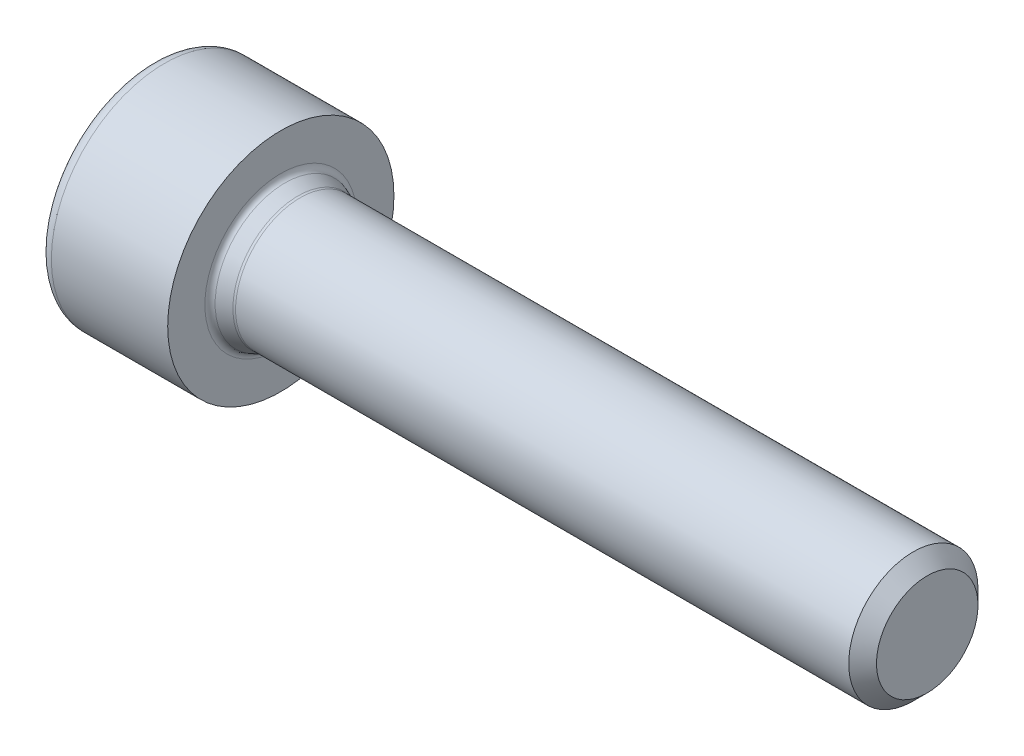
ISO-10303-21;
HEADER;
FILE_DESCRIPTION(('STEP AP214'),'2;1');
FILE_NAME('part.step','',(''),(''),'','','');
FILE_SCHEMA(('AUTOMOTIVE_DESIGN { 1 0 10303 214 1 1 1 1 }'));
ENDSEC;
DATA;
#1=APPLICATION_CONTEXT('core data for automotive mechanical design processes');
#2=APPLICATION_PROTOCOL_DEFINITION('international standard','automotive_design',2000,#1);
#3=PRODUCT_CONTEXT('',#1,'mechanical');
#4=PRODUCT('Part','Part','',(#3));
#5=PRODUCT_RELATED_PRODUCT_CATEGORY('part','',(#4));
#6=PRODUCT_DEFINITION_FORMATION('','',#4);
#7=PRODUCT_DEFINITION_CONTEXT('part definition',#1,'design');
#8=PRODUCT_DEFINITION('design','',#6,#7);
#9=PRODUCT_DEFINITION_SHAPE('','',#8);
#10=(LENGTH_UNIT() NAMED_UNIT(*) SI_UNIT(.MILLI.,.METRE.));
#11=(NAMED_UNIT(*) PLANE_ANGLE_UNIT() SI_UNIT($,.RADIAN.));
#12=(NAMED_UNIT(*) SI_UNIT($,.STERADIAN.) SOLID_ANGLE_UNIT());
#13=UNCERTAINTY_MEASURE_WITH_UNIT(LENGTH_MEASURE(1.E-05),#10,'distance_accuracy_value','');
#14=(GEOMETRIC_REPRESENTATION_CONTEXT(3) GLOBAL_UNCERTAINTY_ASSIGNED_CONTEXT((#13)) GLOBAL_UNIT_ASSIGNED_CONTEXT((#10,
#11,#12)) REPRESENTATION_CONTEXT('',''));
#15=CARTESIAN_POINT('',(0.,0.,0.));
#16=DIRECTION('',(0.,0.,1.));
#17=DIRECTION('',(1.,0.,0.));
#18=AXIS2_PLACEMENT_3D('',#15,#16,#17);
#19=CARTESIAN_POINT('',(-2.,0.,0.));
#20=DIRECTION('',(-1.,0.,0.));
#21=DIRECTION('',(0.,0.,1.));
#22=AXIS2_PLACEMENT_3D('',#19,#20,#21);
#23=CONICAL_SURFACE('',#22,1.5,1.0471975511966);
#24=CARTESIAN_POINT('',(-2.,0.,0.));
#25=DIRECTION('',(1.,0.,0.));
#26=DIRECTION('',(0.,0.,-1.));
#27=AXIS2_PLACEMENT_3D('',#24,#25,#26);
#28=CIRCLE('',#27,1.5);
#29=CARTESIAN_POINT('',(-2.,0.,-1.5));
#30=VERTEX_POINT('',#29);
#31=CARTESIAN_POINT('',(-2.,1.29903810567666,-0.75));
#32=VERTEX_POINT('',#31);
#33=EDGE_CURVE('E362',#30,#32,#28,.T.);
#34=ORIENTED_EDGE('',*,*,#33,.F.);
#35=CARTESIAN_POINT('',(-2.,0.,0.));
#36=DIRECTION('',(1.,0.,0.));
#37=DIRECTION('',(0.,0.,1.));
#38=AXIS2_PLACEMENT_3D('',#35,#36,#37);
#39=CIRCLE('',#38,1.5);
#40=CARTESIAN_POINT('',(-2.,-1.29903810567666,-0.75));
#41=VERTEX_POINT('',#40);
#42=EDGE_CURVE('E376',#41,#30,#39,.T.);
#43=ORIENTED_EDGE('',*,*,#42,.F.);
#44=CARTESIAN_POINT('',(-2.,0.,0.));
#45=DIRECTION('',(1.,0.,0.));
#46=DIRECTION('',(0.,0.,1.));
#47=AXIS2_PLACEMENT_3D('',#44,#45,#46);
#48=CIRCLE('',#47,1.5);
#49=CARTESIAN_POINT('',(-2.,-1.29903810567666,0.75));
#50=VERTEX_POINT('',#49);
#51=EDGE_CURVE('E387',#50,#41,#48,.T.);
#52=ORIENTED_EDGE('',*,*,#51,.F.);
#53=CARTESIAN_POINT('',(-2.,0.,0.));
#54=DIRECTION('',(1.,0.,0.));
#55=DIRECTION('',(0.,0.,1.));
#56=AXIS2_PLACEMENT_3D('',#53,#54,#55);
#57=CIRCLE('',#56,1.5);
#58=CARTESIAN_POINT('',(-2.,0.,1.5));
#59=VERTEX_POINT('',#58);
#60=EDGE_CURVE('E660',#59,#50,#57,.T.);
#61=ORIENTED_EDGE('',*,*,#60,.F.);
#62=CARTESIAN_POINT('',(-2.,0.,0.));
#63=DIRECTION('',(1.,0.,0.));
#64=DIRECTION('',(0.,0.,1.));
#65=AXIS2_PLACEMENT_3D('',#62,#63,#64);
#66=CIRCLE('',#65,1.5);
#67=CARTESIAN_POINT('',(-2.,1.29903810567666,0.75));
#68=VERTEX_POINT('',#67);
#69=EDGE_CURVE('E11',#68,#59,#66,.T.);
#70=ORIENTED_EDGE('',*,*,#69,.F.);
#71=CARTESIAN_POINT('',(-2.,0.,0.));
#72=DIRECTION('',(1.,0.,0.));
#73=DIRECTION('',(0.,0.,1.));
#74=AXIS2_PLACEMENT_3D('',#71,#72,#73);
#75=CIRCLE('',#74,1.5);
#76=EDGE_CURVE('E382',#32,#68,#75,.T.);
#77=ORIENTED_EDGE('',*,*,#76,.F.);
#78=EDGE_LOOP('',(#34,#43,#52,#61,#70,#77));
#79=FACE_BOUND('',#78,.T.);
#80=CARTESIAN_POINT('',(-1.13397459621556,0.,0.));
#81=VERTEX_POINT('',#80);
#82=VERTEX_LOOP('',#81);
#83=FACE_BOUND('',#82,.T.);
#84=ADVANCED_FACE('F16',(#79,#83),#23,.F.);
#85=CARTESIAN_POINT('',(-2.,1.5,0.));
#86=DIRECTION('',(-1.,0.,0.));
#87=DIRECTION('',(0.,0.,1.));
#88=AXIS2_PLACEMENT_3D('',#85,#86,#87);
#89=PLANE('',#88);
#90=DIRECTION('',(0.,-0.5,0.866025403784439));
#91=VECTOR('',#90,1.);
#92=CARTESIAN_POINT('',(-2.,1.73205080756888,0.));
#93=LINE('',#92,#91);
#94=CARTESIAN_POINT('',(-2.,0.866025403784439,1.5));
#95=VERTEX_POINT('',#94);
#96=EDGE_CURVE('E28',#68,#95,#93,.T.);
#97=ORIENTED_EDGE('',*,*,#96,.F.);
#98=ORIENTED_EDGE('',*,*,#69,.T.);
#99=DIRECTION('',(0.,-1.,0.));
#100=VECTOR('',#99,1.);
#101=CARTESIAN_POINT('',(-2.,0.866025403784439,1.5));
#102=LINE('',#101,#100);
#103=EDGE_CURVE('E158',#95,#59,#102,.T.);
#104=ORIENTED_EDGE('',*,*,#103,.F.);
#105=EDGE_LOOP('',(#97,#98,#104));
#106=FACE_BOUND('',#105,.T.);
#107=ADVANCED_FACE('F263',(#106),#89,.T.);
#108=CARTESIAN_POINT('',(-2.,1.73205080756888,0.));
#109=DIRECTION('',(0.,-0.866025403784439,-0.5));
#110=DIRECTION('',(0.,0.5,-0.866025403784439));
#111=AXIS2_PLACEMENT_3D('',#108,#109,#110);
#112=PLANE('',#111);
#113=CARTESIAN_POINT('',(-3.99541053160954,1.73205080756799,-2.91415085731727E-13));
#114=CARTESIAN_POINT('',(-3.98491609936371,1.71387248660795,0.0314813500999125));
#115=CARTESIAN_POINT('',(-3.97487813695248,1.69562947387949,0.0630817864731254));
#116=CARTESIAN_POINT('',(-3.95606958148687,1.65945843540032,0.125756771127396));
#117=CARTESIAN_POINT('',(-3.94727428627704,1.64153340605649,0.156825653831237));
#118=CARTESIAN_POINT('',(-3.93094719604928,1.60591237011731,0.218590620594916));
#119=CARTESIAN_POINT('',(-3.92339436067336,1.58821858581754,0.249282388351878));
#120=CARTESIAN_POINT('',(-3.90955276383433,1.55295548320414,0.310459474175655));
#121=CARTESIAN_POINT('',(-3.90324856990244,1.53538762515303,0.340942133964703));
#122=CARTESIAN_POINT('',(-3.89162174472688,1.49940622764457,0.403241413656977));
#123=CARTESIAN_POINT('',(-3.88634723670264,1.48098651807855,0.435063513460752));
#124=CARTESIAN_POINT('',(-3.87732547646582,1.4444129547335,0.498235664126605));
#125=CARTESIAN_POINT('',(-3.87355036672699,1.42626094890301,0.529582771932558));
#126=CARTESIAN_POINT('',(-3.86752016574308,1.39009868748624,0.592129366346406));
#127=CARTESIAN_POINT('',(-3.86525178705197,1.37208861545174,0.623327667256955));
#128=CARTESIAN_POINT('',(-3.86221737174893,1.33601425471143,0.68587769379456));
#129=CARTESIAN_POINT('',(-3.86145538772594,1.31794995034123,0.717229606428529));
#130=CARTESIAN_POINT('',(-3.86141748043473,1.28172760162123,0.779996829665478));
#131=CARTESIAN_POINT('',(-3.86214570928683,1.26356943635161,0.811412073096422));
#132=CARTESIAN_POINT('',(-3.86512214301144,1.22735081354673,0.874131954530842));
#133=CARTESIAN_POINT('',(-3.86736689792117,1.20929022782371,0.905436681815724));
#134=CARTESIAN_POINT('',(-3.87335893837123,1.17309638852142,0.968258671361456));
#135=CARTESIAN_POINT('',(-3.87712031909711,1.15496407896759,0.999775121230081));
#136=CARTESIAN_POINT('',(-3.88612267814765,1.11839911263106,1.0632951346093));
#137=CARTESIAN_POINT('',(-3.89139242195919,1.09996792366837,1.09529543037641));
#138=CARTESIAN_POINT('',(-3.90301947272482,1.06383160289439,1.15787856269248));
#139=CARTESIAN_POINT('',(-3.90932868001401,1.04612512102595,1.18846961607005));
#140=CARTESIAN_POINT('',(-3.92319039056356,1.01059964207876,1.24985728968498));
#141=CARTESIAN_POINT('',(-3.93075805708399,0.992782196260882,1.28065137584001));
#142=CARTESIAN_POINT('',(-3.94712379360495,0.956940594771838,1.34262457162865));
#143=CARTESIAN_POINT('',(-3.95594278256656,0.938919081836445,1.37379964938489));
#144=CARTESIAN_POINT('',(-3.97480766744456,0.902579507936743,1.43669169236176));
#145=CARTESIAN_POINT('',(-3.98487827134901,0.884264956556424,1.46840329224238));
#146=CARTESIAN_POINT('',(-3.9954105316098,0.866025403784073,1.49999999999971));
#147=B_SPLINE_CURVE_WITH_KNOTS('',3,(#113,#114,#115,#116,#117,#118,#119,#120,#121,#122,#123,
#124,#125,#126,#127,#128,#129,#130,#131,#132,#133,#134,#135,#136,#137,#138,#139,#140,#141,#142,
#143,#144,#145,#146),.UNSPECIFIED.,.F.,.F.,(4,2,2,2,2,2,2,2,2,2,2,2,2,2,2,2,4),(0.,
0.113514052237103,0.224294052163349,0.332944269070679,0.440153902006896,0.551563150922586,
0.660793032879244,0.769046384571246,0.877590571430403,0.986437602357815,1.09503784601424,
1.20467155757587,1.3165539560726,1.42424789890143,1.53334851792614,1.64455373877811,
1.75847542983326),.UNSPECIFIED.);
#148=CARTESIAN_POINT('',(-3.99541053161005,1.73205080756888,0.));
#149=VERTEX_POINT('',#148);
#150=CARTESIAN_POINT('',(-3.99541053161005,0.866025403784439,1.5));
#151=VERTEX_POINT('',#150);
#152=EDGE_CURVE('E154',#149,#151,#147,.T.);
#153=ORIENTED_EDGE('',*,*,#152,.F.);
#154=DIRECTION('',(-1.,0.,0.));
#155=VECTOR('',#154,1.);
#156=CARTESIAN_POINT('',(-2.,1.73205080756888,0.));
#157=LINE('',#156,#155);
#158=CARTESIAN_POINT('',(-2.,1.73205080756888,0.));
#159=VERTEX_POINT('',#158);
#160=EDGE_CURVE('E328',#159,#149,#157,.T.);
#161=ORIENTED_EDGE('',*,*,#160,.F.);
#162=DIRECTION('',(0.,-0.5,0.866025403784439));
#163=VECTOR('',#162,1.);
#164=CARTESIAN_POINT('',(-2.,1.73205080756888,0.));
#165=LINE('',#164,#163);
#166=EDGE_CURVE('E380',#159,#68,#165,.T.);
#167=ORIENTED_EDGE('',*,*,#166,.T.);
#168=ORIENTED_EDGE('',*,*,#96,.T.);
#169=DIRECTION('',(-1.,0.,0.));
#170=VECTOR('',#169,1.);
#171=CARTESIAN_POINT('',(-2.,0.866025403784439,1.5));
#172=LINE('',#171,#170);
#173=EDGE_CURVE('E150',#95,#151,#172,.T.);
#174=ORIENTED_EDGE('',*,*,#173,.T.);
#175=EDGE_LOOP('',(#153,#161,#167,#168,#174));
#176=FACE_BOUND('',#175,.T.);
#177=ADVANCED_FACE('F152',(#176),#112,.T.);
#178=CARTESIAN_POINT('',(-2.,0.866025403784439,-1.5));
#179=DIRECTION('',(0.,-0.866025403784439,0.5));
#180=DIRECTION('',(-1.,0.,0.));
#181=AXIS2_PLACEMENT_3D('',#178,#179,#180);
#182=PLANE('',#181);
#183=CARTESIAN_POINT('',(-3.99541053160954,0.866025403783751,-1.49999999999938));
#184=CARTESIAN_POINT('',(-3.98491609936369,0.88419989223597,-1.46851643719967));
#185=CARTESIAN_POINT('',(-3.97487813695244,0.902445166541645,-1.4369173065486));
#186=CARTESIAN_POINT('',(-3.9560695814868,0.938637776194489,-1.37425477601715));
#187=CARTESIAN_POINT('',(-3.94727428627697,0.956581703211299,-1.34319680388987));
#188=CARTESIAN_POINT('',(-3.9309471960492,0.992261215522943,-1.28146559847558));
#189=CARTESIAN_POINT('',(-3.92339436067329,1.00999417393763,-1.25079644790444));
#190=CARTESIAN_POINT('',(-3.90955276383429,1.04534353308378,-1.18966916231317));
#191=CARTESIAN_POINT('',(-3.90324856990242,1.06295836181044,-1.15921362105637));
#192=CARTESIAN_POINT('',(-3.8916217447269,1.09892042190715,-1.09690317690438));
#193=CARTESIAN_POINT('',(-3.88634723670269,1.11726931395596,-1.06504019058807));
#194=CARTESIAN_POINT('',(-3.8773254764659,1.15369121957175,-1.00178048029153));
#195=CARTESIAN_POINT('',(-3.87355036672708,1.17176260835164,-0.970386828209732));
#196=CARTESIAN_POINT('',(-3.86752016574318,1.20784841732587,-0.907796093957599));
#197=CARTESIAN_POINT('',(-3.86525178705206,1.22586190245208,-0.876599763596434));
#198=CARTESIAN_POINT('',(-3.86221737174898,1.26199463407089,-0.814083437501126));
#199=CARTESIAN_POINT('',(-3.86145538772596,1.28011403468404,-0.782763334697773));
#200=CARTESIAN_POINT('',(-3.8614174804347,1.31636087017216,-0.720010248902997));
#201=CARTESIAN_POINT('',(-3.86214570928677,1.33448818641454,-0.688577194777962));
#202=CARTESIAN_POINT('',(-3.86512214301135,1.37069588565657,-0.625851006621714));
#203=CARTESIAN_POINT('',(-3.86736689792108,1.38877628188229,-0.594557716935941));
#204=CARTESIAN_POINT('',(-3.87335893837113,1.42508480109405,-0.531801937866814));
#205=CARTESIAN_POINT('',(-3.87712031909703,1.44331269254048,-0.500340672229584));
#206=CARTESIAN_POINT('',(-3.88612267814759,1.48004015460745,-0.43691447580395));
#207=CARTESIAN_POINT('',(-3.89139242195916,1.4985376291891,-0.404952450056695));
#208=CARTESIAN_POINT('',(-3.90301947272484,1.53466805123634,-0.342365912108977));
#209=CARTESIAN_POINT('',(-3.90932868001405,1.55230743965566,-0.311736122310441));
#210=CARTESIAN_POINT('',(-3.92319039056362,1.58770798501187,-0.25027631825303));
#211=CARTESIAN_POINT('',(-3.93075805708406,1.60546772299953,-0.219448914466659));
#212=CARTESIAN_POINT('',(-3.94712379360501,1.64121728416166,-0.157422579170501));
#213=CARTESIAN_POINT('',(-3.95594278256662,1.65920493699581,-0.126227952275709));
#214=CARTESIAN_POINT('',(-3.9748076674446,1.69550125695978,-0.0633109366274953));
#215=CARTESIAN_POINT('',(-3.98487827134903,1.71380703236084,-0.0315942699329643));
#216=CARTESIAN_POINT('',(-3.9954105316098,1.73205080756844,1.674038112392E-13));
#217=B_SPLINE_CURVE_WITH_KNOTS('',3,(#183,#184,#185,#186,#187,#188,#189,#190,#191,#192,#193,
#194,#195,#196,#197,#198,#199,#200,#201,#202,#203,#204,#205,#206,#207,#208,#209,#210,#211,#212,
#213,#214,#215,#216),.UNSPECIFIED.,.F.,.F.,(4,2,2,2,2,2,2,2,2,2,2,2,2,2,2,2,4),(0.,
0.113514052237317,0.224294052163627,0.33294426907088,0.440153902006892,0.551563150922337,
0.660793032878924,0.769046384571013,0.877590571430392,0.986437602357563,1.0950378460139,
1.2046715575756,1.31655395607259,1.42424789890161,1.53334851792639,1.6445537387783,
1.75847542983326),.UNSPECIFIED.);
#218=CARTESIAN_POINT('',(-3.99541053161005,0.866025403784438,-1.5));
#219=VERTEX_POINT('',#218);
#220=EDGE_CURVE('E181',#219,#149,#217,.T.);
#221=ORIENTED_EDGE('',*,*,#220,.F.);
#222=DIRECTION('',(-1.,0.,0.));
#223=VECTOR('',#222,1.);
#224=CARTESIAN_POINT('',(-2.,0.866025403784438,-1.5));
#225=LINE('',#224,#223);
#226=CARTESIAN_POINT('',(-2.,0.866025403784438,-1.5));
#227=VERTEX_POINT('',#226);
#228=EDGE_CURVE('E331',#227,#219,#225,.T.);
#229=ORIENTED_EDGE('',*,*,#228,.F.);
#230=DIRECTION('',(0.,0.5,0.866025403784439));
#231=VECTOR('',#230,1.);
#232=CARTESIAN_POINT('',(-2.,0.866025403784439,-1.5));
#233=LINE('',#232,#231);
#234=EDGE_CURVE('E353',#227,#32,#233,.T.);
#235=ORIENTED_EDGE('',*,*,#234,.T.);
#236=DIRECTION('',(0.,0.5,0.866025403784439));
#237=VECTOR('',#236,1.);
#238=CARTESIAN_POINT('',(-2.,0.866025403784439,-1.5));
#239=LINE('',#238,#237);
#240=EDGE_CURVE('E364',#32,#159,#239,.T.);
#241=ORIENTED_EDGE('',*,*,#240,.T.);
#242=ORIENTED_EDGE('',*,*,#160,.T.);
#243=EDGE_LOOP('',(#221,#229,#235,#241,#242));
#244=FACE_BOUND('',#243,.T.);
#245=ADVANCED_FACE('F262',(#244),#182,.T.);
#246=CARTESIAN_POINT('',(-2.,-0.866025403784439,-1.5));
#247=DIRECTION('',(0.,0.,1.));
#248=DIRECTION('',(1.,0.,0.));
#249=AXIS2_PLACEMENT_3D('',#246,#247,#248);
#250=PLANE('',#249);
#251=CARTESIAN_POINT('',(-3.99541053161005,-0.866025403784441,-1.49999999999999));
#252=CARTESIAN_POINT('',(-3.98491442447622,-0.829667002160912,-1.49999772200754));
#253=CARTESIAN_POINT('',(-3.97487599519512,-0.793172793193832,-1.50000115660245));
#254=CARTESIAN_POINT('',(-3.9560659934119,-0.720788734899222,-1.50002028715008));
#255=CARTESIAN_POINT('',(-3.94726991012646,-0.684905239458469,-1.50003568861586));
#256=CARTESIAN_POINT('',(-3.93094071859646,-0.613567150515573,-1.50007897258033));
#257=CARTESIAN_POINT('',(-3.92338679982314,-0.578117351145402,-1.50010661252872));
#258=CARTESIAN_POINT('',(-3.90954260558954,-0.507450411100321,-1.5001654197157));
#259=CARTESIAN_POINT('',(-3.9032371604363,-0.472236249120683,-1.50019653635299));
#260=CARTESIAN_POINT('',(-3.8915959041439,-0.400152962591617,-1.50018959662247));
#261=CARTESIAN_POINT('',(-3.88631091822916,-0.363275572900214,-1.5001486291692));
#262=CARTESIAN_POINT('',(-3.87727606801317,-0.290071341384469,-1.50005726189268));
#263=CARTESIAN_POINT('',(-3.87349793474577,-0.253748018783533,-1.50000706443685));
#264=CARTESIAN_POINT('',(-3.86746968082562,-0.18130620209288,-1.499954069001));
#265=CARTESIAN_POINT('',(-3.8652059812783,-0.145188847888625,-1.49995084426161));
#266=CARTESIAN_POINT('',(-3.86218855371717,-0.0727974850467571,-1.49997319407975));
#267=CARTESIAN_POINT('',(-3.86143875609999,-0.0365233130409884,-1.49999884333213));
#268=CARTESIAN_POINT('',(-3.86143313797201,0.0360328534078611,-1.50000115691296));
#269=CARTESIAN_POINT('',(-3.86217763405278,0.0723148478798276,-1.49997781086086));
#270=CARTESIAN_POINT('',(-3.86518716289433,0.144734143627241,-1.4999625484033));
#271=CARTESIAN_POINT('',(-3.86744877187048,0.18087158679929,-1.49997056142382));
#272=CARTESIAN_POINT('',(-3.87347487954609,0.253366839623746,-1.50003182506455));
#273=CARTESIAN_POINT('',(-3.87725350497301,0.289723464254857,-1.50008550636752));
#274=CARTESIAN_POINT('',(-3.88629081735438,0.363008647167812,-1.50017858138886));
#275=CARTESIAN_POINT('',(-3.89157829657305,0.399933624167103,-1.5002176591672));
#276=CARTESIAN_POINT('',(-3.90322125349871,0.472077724936609,-1.50021788015492));
#277=CARTESIAN_POINT('',(-3.90952472301685,0.507305299510007,-1.50018211968679));
#278=CARTESIAN_POINT('',(-3.9233673330968,0.577999292657766,-1.50011632761116));
#279=CARTESIAN_POINT('',(-3.93092168652884,0.613462725707689,-1.50008637785758));
#280=CARTESIAN_POINT('',(-3.94725336362325,0.684828961077203,-1.50003934029814));
#281=CARTESIAN_POINT('',(-3.95605155233801,0.720726957667892,-1.50002251302336));
#282=CARTESIAN_POINT('',(-3.97486750942327,0.793141351013658,-1.50000149265882));
#283=CARTESIAN_POINT('',(-3.98490985867147,0.829651376396721,-1.49999761890492));
#284=CARTESIAN_POINT('',(-3.99541053161004,0.86602540378444,-1.49999999999999));
#285=B_SPLINE_CURVE_WITH_KNOTS('',3,(#251,#252,#253,#254,#255,#256,#257,#258,#259,#260,#261,
#262,#263,#264,#265,#266,#267,#268,#269,#270,#271,#272,#273,#274,#275,#276,#277,#278,#279,#280,
#281,#282,#283,#284),.UNSPECIFIED.,.F.,.F.,(4,2,2,2,2,2,2,2,2,2,2,2,2,2,2,2,4),(0.,
0.113531519817187,0.224354400305832,0.333072912111754,0.440376153407204,0.552112761035282,
0.661641577479632,0.770174668912822,0.878989173822856,0.987826735372861,1.09641949753744,
1.206047862112,1.31792683242958,1.42526861458875,1.5340273412987,1.64489395088055,
1.7584743026634),.UNSPECIFIED.);
#286=CARTESIAN_POINT('',(-3.99541053161005,-0.866025403784439,-1.5));
#287=VERTEX_POINT('',#286);
#288=EDGE_CURVE('E290',#287,#219,#285,.T.);
#289=ORIENTED_EDGE('',*,*,#288,.F.);
#290=DIRECTION('',(-1.,0.,0.));
#291=VECTOR('',#290,1.);
#292=CARTESIAN_POINT('',(-2.,-0.866025403784439,-1.5));
#293=LINE('',#292,#291);
#294=CARTESIAN_POINT('',(-2.,-0.866025403784439,-1.5));
#295=VERTEX_POINT('',#294);
#296=EDGE_CURVE('E282',#295,#287,#293,.T.);
#297=ORIENTED_EDGE('',*,*,#296,.F.);
#298=DIRECTION('',(0.,1.,0.));
#299=VECTOR('',#298,1.);
#300=CARTESIAN_POINT('',(-2.,-0.866025403784439,-1.5));
#301=LINE('',#300,#299);
#302=EDGE_CURVE('E367',#295,#30,#301,.T.);
#303=ORIENTED_EDGE('',*,*,#302,.T.);
#304=DIRECTION('',(0.,1.,0.));
#305=VECTOR('',#304,1.);
#306=CARTESIAN_POINT('',(-2.,-0.866025403784439,-1.5));
#307=LINE('',#306,#305);
#308=EDGE_CURVE('E360',#30,#227,#307,.T.);
#309=ORIENTED_EDGE('',*,*,#308,.T.);
#310=ORIENTED_EDGE('',*,*,#228,.T.);
#311=EDGE_LOOP('',(#289,#297,#303,#309,#310));
#312=FACE_BOUND('',#311,.T.);
#313=ADVANCED_FACE('F267',(#312),#250,.T.);
#314=CARTESIAN_POINT('',(-2.,-1.73205080756888,0.));
#315=DIRECTION('',(0.,0.866025403784439,0.5));
#316=DIRECTION('',(1.,0.,0.));
#317=AXIS2_PLACEMENT_3D('',#314,#315,#316);
#318=PLANE('',#317);
#319=CARTESIAN_POINT('',(-3.99541053160954,-1.73205080756799,2.95048896056747E-13));
#320=CARTESIAN_POINT('',(-3.98491609936372,-1.71387248660798,-0.0314813500998547));
#321=CARTESIAN_POINT('',(-3.97487813695252,-1.69562947387956,-0.0630817864730168));
#322=CARTESIAN_POINT('',(-3.95606958148693,-1.65945843540045,-0.125756771127226));
#323=CARTESIAN_POINT('',(-3.94727428627711,-1.64153340605663,-0.156825653831056));
#324=CARTESIAN_POINT('',(-3.93094719604935,-1.60591237011746,-0.218590620594744));
#325=CARTESIAN_POINT('',(-3.92339436067343,-1.58821858581768,-0.249282388351727));
#326=CARTESIAN_POINT('',(-3.90955276383437,-1.55295548320423,-0.310459474175567));
#327=CARTESIAN_POINT('',(-3.90324856990246,-1.53538762515308,-0.340942133964658));
#328=CARTESIAN_POINT('',(-3.89162174472688,-1.49940622764458,-0.403241413656913));
#329=CARTESIAN_POINT('',(-3.88634723670264,-1.48098651807858,-0.435063513460627));
#330=CARTESIAN_POINT('',(-3.87732547646581,-1.44441295473356,-0.498235664126404));
#331=CARTESIAN_POINT('',(-3.87355036672699,-1.42626094890309,-0.529582771932342));
#332=CARTESIAN_POINT('',(-3.86752016574308,-1.39009868748633,-0.592129366346198));
#333=CARTESIAN_POINT('',(-3.86525178705197,-1.37208861545183,-0.62332766725677));
#334=CARTESIAN_POINT('',(-3.86221737174893,-1.33601425471148,-0.685877693794454));
#335=CARTESIAN_POINT('',(-3.86145538772594,-1.31794995034126,-0.717229606428477));
#336=CARTESIAN_POINT('',(-3.86141748043473,-1.28172760162126,-0.77999682966543));
#337=CARTESIAN_POINT('',(-3.86214570928683,-1.26356943635167,-0.811412073096322));
#338=CARTESIAN_POINT('',(-3.86512214301144,-1.22735081354685,-0.874131954530676));
#339=CARTESIAN_POINT('',(-3.86736689792117,-1.20929022782385,-0.905436681815544));
#340=CARTESIAN_POINT('',(-3.87335893837123,-1.17309638852157,-0.968258671361281));
#341=CARTESIAN_POINT('',(-3.87712031909712,-1.15496407896773,-0.999775121229925));
#342=CARTESIAN_POINT('',(-3.88612267814765,-1.11839911263115,-1.06329513460921));
#343=CARTESIAN_POINT('',(-3.89139242195919,-1.09996792366842,-1.09529543037636));
#344=CARTESIAN_POINT('',(-3.9030194727248,-1.0638316028944,-1.15787856269242));
#345=CARTESIAN_POINT('',(-3.90932868001397,-1.04612512102599,-1.18846961606993));
#346=CARTESIAN_POINT('',(-3.92319039056349,-1.01059964207882,-1.24985728968478));
#347=CARTESIAN_POINT('',(-3.93075805708393,-0.992782196260957,-1.2806513758398));
#348=CARTESIAN_POINT('',(-3.94712379360488,-0.956940594771925,-1.34262457162844));
#349=CARTESIAN_POINT('',(-3.95594278256649,-0.93891908183653,-1.37379964938471));
#350=CARTESIAN_POINT('',(-3.97480766744453,-0.902579507936801,-1.43669169236165));
#351=CARTESIAN_POINT('',(-3.984878271349,-0.884264956556455,-1.46840329224232));
#352=CARTESIAN_POINT('',(-3.9954105316098,-0.866025403784074,-1.49999999999971));
#353=B_SPLINE_CURVE_WITH_KNOTS('',3,(#319,#320,#321,#322,#323,#324,#325,#326,#327,#328,#329,
#330,#331,#332,#333,#334,#335,#336,#337,#338,#339,#340,#341,#342,#343,#344,#345,#346,#347,#348,
#349,#350,#351,#352),.UNSPECIFIED.,.F.,.F.,(4,2,2,2,2,2,2,2,2,2,2,2,2,2,2,2,4),(0.,
0.113514052236908,0.224294052163097,0.332944269070495,0.440153902006896,0.551563150922404,
0.660793032879003,0.769046384571068,0.877590571430412,0.986437602357636,1.095037846014,
1.20467155757568,1.3165539560726,1.42424789890124,1.53334851792589,1.64455373877792,
1.75847542983327),.UNSPECIFIED.);
#354=CARTESIAN_POINT('',(-3.99541053161005,-1.73205080756888,0.));
#355=VERTEX_POINT('',#354);
#356=EDGE_CURVE('E285',#355,#287,#353,.T.);
#357=ORIENTED_EDGE('',*,*,#356,.F.);
#358=DIRECTION('',(-1.,0.,0.));
#359=VECTOR('',#358,1.);
#360=CARTESIAN_POINT('',(-2.,-1.73205080756888,0.));
#361=LINE('',#360,#359);
#362=CARTESIAN_POINT('',(-2.,-1.73205080756888,0.));
#363=VERTEX_POINT('',#362);
#364=EDGE_CURVE('E242',#363,#355,#361,.T.);
#365=ORIENTED_EDGE('',*,*,#364,.F.);
#366=DIRECTION('',(0.,0.5,-0.866025403784439));
#367=VECTOR('',#366,1.);
#368=CARTESIAN_POINT('',(-2.,-1.73205080756888,0.));
#369=LINE('',#368,#367);
#370=EDGE_CURVE('E389',#363,#41,#369,.T.);
#371=ORIENTED_EDGE('',*,*,#370,.T.);
#372=DIRECTION('',(0.,0.5,-0.866025403784439));
#373=VECTOR('',#372,1.);
#374=CARTESIAN_POINT('',(-2.,-1.73205080756888,0.));
#375=LINE('',#374,#373);
#376=EDGE_CURVE('E392',#41,#295,#375,.T.);
#377=ORIENTED_EDGE('',*,*,#376,.T.);
#378=ORIENTED_EDGE('',*,*,#296,.T.);
#379=EDGE_LOOP('',(#357,#365,#371,#377,#378));
#380=FACE_BOUND('',#379,.T.);
#381=ADVANCED_FACE('F255',(#380),#318,.T.);
#382=CARTESIAN_POINT('',(-2.,-0.866025403784439,1.5));
#383=DIRECTION('',(0.,0.866025403784439,-0.5));
#384=DIRECTION('',(-1.,0.,0.));
#385=AXIS2_PLACEMENT_3D('',#382,#383,#384);
#386=PLANE('',#385);
#387=CARTESIAN_POINT('',(-3.99541053160954,-0.866025403783756,1.49999999999938));
#388=CARTESIAN_POINT('',(-3.9849160993638,-0.884199892235779,1.46851643720002));
#389=CARTESIAN_POINT('',(-3.97487813695268,-0.902445166541286,1.4369173065493));
#390=CARTESIAN_POINT('',(-3.9560695814872,-0.938637776193949,1.37425477601834));
#391=CARTESIAN_POINT('',(-3.9472742862774,-0.956581703210745,1.34319680389119));
#392=CARTESIAN_POINT('',(-3.93094719604964,-0.992261215522466,1.28146559847692));
#393=CARTESIAN_POINT('',(-3.9233943606737,-1.00999417393724,1.25079644790566));
#394=CARTESIAN_POINT('',(-3.90955276383453,-1.04534353308358,1.18966916231391));
#395=CARTESIAN_POINT('',(-3.90324856990254,-1.06295836181034,1.15921362105675));
#396=CARTESIAN_POINT('',(-3.89162174472688,-1.09892042190694,1.09690317690454));
#397=CARTESIAN_POINT('',(-3.88634723670263,-1.11726931395553,1.06504019058838));
#398=CARTESIAN_POINT('',(-3.8773254764658,-1.15369121957106,1.00178048029205));
#399=CARTESIAN_POINT('',(-3.87355036672698,-1.17176260835091,0.970386828210329));
#400=CARTESIAN_POINT('',(-3.86752016574308,-1.20784841732518,0.907796093958225));
#401=CARTESIAN_POINT('',(-3.86525178705197,-1.22586190245147,0.876599763597015));
#402=CARTESIAN_POINT('',(-3.86221737174892,-1.26199463407054,0.814083437501486));
#403=CARTESIAN_POINT('',(-3.86145538772593,-1.28011403468387,0.782763334697955));
#404=CARTESIAN_POINT('',(-3.86141748043473,-1.31636087017228,0.720010248902896));
#405=CARTESIAN_POINT('',(-3.86214570928683,-1.33448818641476,0.688577194777755));
#406=CARTESIAN_POINT('',(-3.86512214301144,-1.3706958856569,0.625851006621352));
#407=CARTESIAN_POINT('',(-3.86736689792117,-1.38877628188265,0.59455771693553));
#408=CARTESIAN_POINT('',(-3.87335893837122,-1.42508480109438,0.531801937866384));
#409=CARTESIAN_POINT('',(-3.87712031909711,-1.44331269254077,0.500340672229182));
#410=CARTESIAN_POINT('',(-3.88612267814764,-1.48004015460761,0.436914475803698));
#411=CARTESIAN_POINT('',(-3.89139242195919,-1.49853762918918,0.404952450056564));
#412=CARTESIAN_POINT('',(-3.90301947272484,-1.53466805123634,0.342365912108971));
#413=CARTESIAN_POINT('',(-3.90932868001405,-1.55230743965566,0.311736122310437));
#414=CARTESIAN_POINT('',(-3.92319039056362,-1.58770798501187,0.250276318253029));
#415=CARTESIAN_POINT('',(-3.93075805708406,-1.60546772299953,0.219448914466657));
#416=CARTESIAN_POINT('',(-3.94712379360501,-1.64121728416166,0.157422579170498));
#417=CARTESIAN_POINT('',(-3.95594278256662,-1.65920493699581,0.126227952275706));
#418=CARTESIAN_POINT('',(-3.9748076674446,-1.69550125695978,0.0633109366274923));
#419=CARTESIAN_POINT('',(-3.98487827134903,-1.71380703236085,0.0315942699329605));
#420=CARTESIAN_POINT('',(-3.9954105316098,-1.73205080756844,-1.72615629271541E-13));
#421=B_SPLINE_CURVE_WITH_KNOTS('',3,(#387,#388,#389,#390,#391,#392,#393,#394,#395,#396,#397,
#398,#399,#400,#401,#402,#403,#404,#405,#406,#407,#408,#409,#410,#411,#412,#413,#414,#415,#416,
#417,#418,#419,#420),.UNSPECIFIED.,.F.,.F.,(4,2,2,2,2,2,2,2,2,2,2,2,2,2,2,2,4),(0.,
0.113514052236079,0.224294052162017,0.332944269069703,0.440153902006876,0.551563150921626,
0.660793032877968,0.769046384570289,0.8775905714304,0.986437602357997,1.09503784601449,
1.20467155757605,1.3165539560726,1.42424789890161,1.53334851792639,1.6445537387783,
1.75847542983326),.UNSPECIFIED.);
#422=CARTESIAN_POINT('',(-3.99541053161005,-0.866025403784439,1.5));
#423=VERTEX_POINT('',#422);
#424=EDGE_CURVE('E172',#423,#355,#421,.T.);
#425=ORIENTED_EDGE('',*,*,#424,.F.);
#426=DIRECTION('',(-1.,0.,0.));
#427=VECTOR('',#426,1.);
#428=CARTESIAN_POINT('',(-2.,-0.866025403784439,1.5));
#429=LINE('',#428,#427);
#430=CARTESIAN_POINT('',(-2.,-0.866025403784439,1.5));
#431=VERTEX_POINT('',#430);
#432=EDGE_CURVE('E166',#431,#423,#429,.T.);
#433=ORIENTED_EDGE('',*,*,#432,.F.);
#434=DIRECTION('',(0.,-0.5,-0.866025403784439));
#435=VECTOR('',#434,1.);
#436=CARTESIAN_POINT('',(-2.,-0.866025403784439,1.5));
#437=LINE('',#436,#435);
#438=EDGE_CURVE('E388',#431,#50,#437,.T.);
#439=ORIENTED_EDGE('',*,*,#438,.T.);
#440=DIRECTION('',(0.,-0.5,-0.866025403784439));
#441=VECTOR('',#440,1.);
#442=CARTESIAN_POINT('',(-2.,-0.866025403784439,1.5));
#443=LINE('',#442,#441);
#444=EDGE_CURVE('E383',#50,#363,#443,.T.);
#445=ORIENTED_EDGE('',*,*,#444,.T.);
#446=ORIENTED_EDGE('',*,*,#364,.T.);
#447=EDGE_LOOP('',(#425,#433,#439,#445,#446));
#448=FACE_BOUND('',#447,.T.);
#449=ADVANCED_FACE('F246',(#448),#386,.T.);
#450=CARTESIAN_POINT('',(-2.,0.866025403784439,1.5));
#451=DIRECTION('',(0.,0.,-1.));
#452=DIRECTION('',(0.,-1.,0.));
#453=AXIS2_PLACEMENT_3D('',#450,#451,#452);
#454=PLANE('',#453);
#455=CARTESIAN_POINT('',(-3.99541053161005,0.866025403784438,1.5));
#456=CARTESIAN_POINT('',(-3.98699221843221,0.836862792814159,1.4999995447585));
#457=CARTESIAN_POINT('',(-3.97886798665481,0.807613734665561,1.50000109062013));
#458=CARTESIAN_POINT('',(-3.96342714836169,0.749524076230543,1.50001144892729));
#459=CARTESIAN_POINT('',(-3.95609772081925,0.720686878574635,1.50002011666102));
#460=CARTESIAN_POINT('',(-3.94224539749916,0.663334741866611,1.50004747140932));
#461=CARTESIAN_POINT('',(-3.93571095743714,0.634822601313587,1.50006598648854));
#462=CARTESIAN_POINT('',(-3.92344644930918,0.578026036456043,1.50010740606747));
#463=CARTESIAN_POINT('',(-3.91770675786418,0.549743695867202,1.50013024828365));
#464=CARTESIAN_POINT('',(-3.9070326501121,0.493302170026705,1.50017388210285));
#465=CARTESIAN_POINT('',(-3.9020911800898,0.465144321043552,1.50019469094304));
#466=CARTESIAN_POINT('',(-3.89277288445539,0.407436662532116,1.50019151270204));
#467=CARTESIAN_POINT('',(-3.88843137719492,0.377881124724174,1.50016547215893));
#468=CARTESIAN_POINT('',(-3.88072641812724,0.319166627231536,1.50009606430967));
#469=CARTESIAN_POINT('',(-3.87734722545162,0.29000974376876,1.5000530071923));
#470=CARTESIAN_POINT('',(-3.87156528140784,0.231918064512556,1.49998833184388));
#471=CARTESIAN_POINT('',(-3.86915233569546,0.202984290472239,1.4999664861205));
#472=CARTESIAN_POINT('',(-3.8652962700489,0.145157419778987,1.49995157639584));
#473=CARTESIAN_POINT('',(-3.86384967321091,0.116264554635848,1.49995840855849));
#474=CARTESIAN_POINT('',(-3.86191840607929,0.0583301172145275,1.49998161733739));
#475=CARTESIAN_POINT('',(-3.86143759681284,0.0292884115646376,1.49999803192636));
#476=CARTESIAN_POINT('',(-3.86143594261767,0.000166048580229913,1.50000000562678));
#477=CARTESIAN_POINT('',(-3.86143594181843,8.30242997780039E-05,1.50000001113547));
#478=CARTESIAN_POINT('',(-3.86143703227168,-0.0289508042834759,1.50000189675071));
#479=CARTESIAN_POINT('',(-3.86191445823357,-0.057903958496926,1.49998959412992));
#480=CARTESIAN_POINT('',(-3.86383648515901,-0.115771912748301,1.49997403216559));
#481=CARTESIAN_POINT('',(-3.86528091651973,-0.144686718621216,1.49997077123675));
#482=CARTESIAN_POINT('',(-3.86913375099204,-0.20256137447125,1.49999168595089));
#483=CARTESIAN_POINT('',(-3.87154575996034,-0.231520984712749,1.50001596485174));
#484=CARTESIAN_POINT('',(-3.877327012581,-0.289668608583161,1.50008385831312));
#485=CARTESIAN_POINT('',(-3.88070658794805,-0.318855587727454,1.50012768458282));
#486=CARTESIAN_POINT('',(-3.8884203163986,-0.377689865179098,1.50019558884968));
#487=CARTESIAN_POINT('',(-3.89277202803949,-0.407334849863434,1.50021925909832));
#488=CARTESIAN_POINT('',(-3.90209424665613,-0.465090315625546,1.50021629586385));
#489=CARTESIAN_POINT('',(-3.90702579630847,-0.493207113073251,1.50019198656295));
#490=CARTESIAN_POINT('',(-3.91768845797004,-0.549618382775125,1.50014262630657));
#491=CARTESIAN_POINT('',(-3.92342799376007,-0.577911260233809,1.50011757006933));
#492=CARTESIAN_POINT('',(-3.93569321997628,-0.634729275838464,1.50007232620048));
#493=CARTESIAN_POINT('',(-3.94222855665145,-0.663252325901121,1.50005220955846));
#494=CARTESIAN_POINT('',(-3.9560837907805,-0.720626895655592,1.50002237380691));
#495=CARTESIAN_POINT('',(-3.96341526379558,-0.749475609798204,1.50001283977423));
#496=CARTESIAN_POINT('',(-3.97886128686378,-0.807589143634853,1.50000135246628));
#497=CARTESIAN_POINT('',(-3.98698869305331,-0.836850551657204,1.49999955669596));
#498=CARTESIAN_POINT('',(-3.99541053161004,-0.866025403784436,1.49999999999999));
#499=B_SPLINE_CURVE_WITH_KNOTS('',3,(#455,#456,#457,#458,#459,#460,#461,#462,#463,#464,#465,
#466,#467,#468,#469,#470,#471,#472,#473,#474,#475,#476,#477,#478,#479,#480,#481,#482,#483,#484,
#485,#486,#487,#488,#489,#490,#491,#492,#493,#494,#495,#496,#497,#498),.UNSPECIFIED.,.F.,.F.,(4,
2,2,2,2,2,2,2,2,2,2,2,2,2,2,2,2,2,2,2,2,4),(0.,0.0910607026798424,0.18031557773353,
0.268060886329157,0.354627880525828,0.440382226311534,0.529987262367741,0.618029145794889,
0.7051159928607,0.791887790856785,0.879005800331668,0.879254873212257,0.966107279526382,
1.05294445680972,1.1401083007485,1.22824000994642,1.31811488529161,1.40374284334266,
1.49034069189516,1.57811848881297,1.66740834305566,1.75850726995888),.UNSPECIFIED.);
#500=EDGE_CURVE('E162',#151,#423,#499,.T.);
#501=ORIENTED_EDGE('',*,*,#500,.F.);
#502=ORIENTED_EDGE('',*,*,#173,.F.);
#503=ORIENTED_EDGE('',*,*,#103,.T.);
#504=DIRECTION('',(0.,-1.,0.));
#505=VECTOR('',#504,1.);
#506=CARTESIAN_POINT('',(-2.,0.866025403784439,1.5));
#507=LINE('',#506,#505);
#508=EDGE_CURVE('E658',#59,#431,#507,.T.);
#509=ORIENTED_EDGE('',*,*,#508,.T.);
#510=ORIENTED_EDGE('',*,*,#432,.T.);
#511=EDGE_LOOP('',(#501,#502,#503,#509,#510));
#512=FACE_BOUND('',#511,.T.);
#513=ADVANCED_FACE('F164',(#512),#454,.T.);
#514=CARTESIAN_POINT('',(-4.,0.,0.));
#515=DIRECTION('',(1.,0.,0.));
#516=DIRECTION('',(0.,1.,0.));
#517=AXIS2_PLACEMENT_3D('',#514,#515,#516);
#518=PLANE('',#517);
#519=CARTESIAN_POINT('',(-4.,0.,0.));
#520=DIRECTION('',(1.,0.,0.));
#521=DIRECTION('',(0.,0.,-1.));
#522=AXIS2_PLACEMENT_3D('',#519,#520,#521);
#523=CIRCLE('',#522,3.1);
#524=CARTESIAN_POINT('',(-4.,0.,-3.1));
#525=VERTEX_POINT('',#524);
#526=EDGE_CURVE('E159',#525,#525,#523,.T.);
#527=ORIENTED_EDGE('',*,*,#526,.F.);
#528=EDGE_LOOP('',(#527));
#529=FACE_BOUND('',#528,.T.);
#530=CARTESIAN_POINT('',(-4.,0.,0.));
#531=DIRECTION('',(1.,0.,0.));
#532=DIRECTION('',(0.,0.,-1.));
#533=AXIS2_PLACEMENT_3D('',#530,#531,#532);
#534=CIRCLE('',#533,1.74);
#535=CARTESIAN_POINT('',(-4.,0.,-1.74));
#536=VERTEX_POINT('',#535);
#537=EDGE_CURVE('E184',#536,#536,#534,.T.);
#538=ORIENTED_EDGE('',*,*,#537,.T.);
#539=EDGE_LOOP('',(#538));
#540=FACE_BOUND('',#539,.T.);
#541=ADVANCED_FACE('F407',(#529,#540),#518,.F.);
#542=CARTESIAN_POINT('',(-3.6,0.,0.));
#543=DIRECTION('',(1.,0.,0.));
#544=DIRECTION('',(0.,0.,-1.));
#545=AXIS2_PLACEMENT_3D('',#542,#543,#544);
#546=TOROIDAL_SURFACE('',#545,3.1,0.4);
#547=CARTESIAN_POINT('',(-3.6,0.,0.));
#548=DIRECTION('',(1.,0.,0.));
#549=DIRECTION('',(0.,0.,-1.));
#550=AXIS2_PLACEMENT_3D('',#547,#548,#549);
#551=CIRCLE('',#550,3.5);
#552=CARTESIAN_POINT('',(-3.6,0.,-3.5));
#553=VERTEX_POINT('',#552);
#554=EDGE_CURVE('E321',#553,#553,#551,.T.);
#555=ORIENTED_EDGE('',*,*,#554,.F.);
#556=EDGE_LOOP('',(#555));
#557=FACE_BOUND('',#556,.T.);
#558=ORIENTED_EDGE('',*,*,#526,.T.);
#559=EDGE_LOOP('',(#558));
#560=FACE_BOUND('',#559,.T.);
#561=ADVANCED_FACE('F409',(#557,#560),#546,.T.);
#562=CARTESIAN_POINT('',(0.,0.,-3.5));
#563=DIRECTION('',(-1.,0.,0.));
#564=DIRECTION('',(0.,0.,1.));
#565=AXIS2_PLACEMENT_3D('',#562,#563,#564);
#566=PLANE('',#565);
#567=CARTESIAN_POINT('',(0.,0.,0.));
#568=DIRECTION('',(1.,0.,0.));
#569=DIRECTION('',(0.,0.,-1.));
#570=AXIS2_PLACEMENT_3D('',#567,#568,#569);
#571=CIRCLE('',#570,3.5);
#572=CARTESIAN_POINT('',(0.,0.,-3.5));
#573=VERTEX_POINT('',#572);
#574=EDGE_CURVE('E322',#573,#573,#571,.T.);
#575=ORIENTED_EDGE('',*,*,#574,.T.);
#576=EDGE_LOOP('',(#575));
#577=FACE_BOUND('',#576,.T.);
#578=CARTESIAN_POINT('',(0.,0.,0.));
#579=DIRECTION('',(1.,0.,0.));
#580=DIRECTION('',(0.,0.,-1.));
#581=AXIS2_PLACEMENT_3D('',#578,#579,#580);
#582=CIRCLE('',#581,2.35);
#583=CARTESIAN_POINT('',(0.,0.,-2.35));
#584=VERTEX_POINT('',#583);
#585=EDGE_CURVE('E318',#584,#584,#582,.T.);
#586=ORIENTED_EDGE('',*,*,#585,.F.);
#587=EDGE_LOOP('',(#586));
#588=FACE_BOUND('',#587,.T.);
#589=ADVANCED_FACE('F417',(#577,#588),#566,.F.);
#590=CARTESIAN_POINT('',(20.,0.,0.));
#591=DIRECTION('',(1.,0.,0.));
#592=DIRECTION('',(0.,0.,-1.));
#593=AXIS2_PLACEMENT_3D('',#590,#591,#592);
#594=CYLINDRICAL_SURFACE('',#593,3.5);
#595=ORIENTED_EDGE('',*,*,#574,.F.);
#596=EDGE_LOOP('',(#595));
#597=FACE_BOUND('',#596,.T.);
#598=ORIENTED_EDGE('',*,*,#554,.T.);
#599=EDGE_LOOP('',(#598));
#600=FACE_BOUND('',#599,.T.);
#601=ADVANCED_FACE('F505',(#597,#600),#594,.T.);
#602=CARTESIAN_POINT('',(0.2,0.,0.));
#603=DIRECTION('',(1.,0.,0.));
#604=DIRECTION('',(0.,0.,-1.));
#605=AXIS2_PLACEMENT_3D('',#602,#603,#604);
#606=TOROIDAL_SURFACE('',#605,2.35,0.2);
#607=ORIENTED_EDGE('',*,*,#585,.T.);
#608=EDGE_LOOP('',(#607));
#609=FACE_BOUND('',#608,.T.);
#610=CARTESIAN_POINT('',(0.129775311682321,0.,0.));
#611=DIRECTION('',(1.,0.,0.));
#612=DIRECTION('',(0.,0.,-1.));
#613=AXIS2_PLACEMENT_3D('',#610,#611,#612);
#614=CIRCLE('',#613,2.16273416448619);
#615=CARTESIAN_POINT('',(0.129775311682321,0.,-2.16273416448619));
#616=VERTEX_POINT('',#615);
#617=EDGE_CURVE('E299',#616,#616,#614,.T.);
#618=ORIENTED_EDGE('',*,*,#617,.F.);
#619=EDGE_LOOP('',(#618));
#620=FACE_BOUND('',#619,.T.);
#621=ADVANCED_FACE('F496',(#609,#620),#606,.F.);
#622=CARTESIAN_POINT('',(20.,0.,0.));
#623=DIRECTION('',(1.,0.,0.));
#624=DIRECTION('',(0.,0.,-1.));
#625=AXIS2_PLACEMENT_3D('',#622,#623,#624);
#626=CYLINDRICAL_SURFACE('',#625,2.);
#627=CARTESIAN_POINT('',(0.6,0.,0.));
#628=DIRECTION('',(-1.,0.,0.));
#629=DIRECTION('',(0.,0.,-1.));
#630=AXIS2_PLACEMENT_3D('',#627,#628,#629);
#631=CIRCLE('',#630,2.);
#632=CARTESIAN_POINT('',(0.6,0.,-2.));
#633=VERTEX_POINT('',#632);
#634=EDGE_CURVE('E306',#633,#633,#631,.T.);
#635=ORIENTED_EDGE('',*,*,#634,.F.);
#636=EDGE_LOOP('',(#635));
#637=FACE_BOUND('',#636,.T.);
#638=CARTESIAN_POINT('',(19.5705,0.,0.));
#639=DIRECTION('',(1.,0.,0.));
#640=DIRECTION('',(0.,0.,-1.));
#641=AXIS2_PLACEMENT_3D('',#638,#639,#640);
#642=CIRCLE('',#641,2.);
#643=CARTESIAN_POINT('',(19.5705,0.,-2.));
#644=VERTEX_POINT('',#643);
#645=EDGE_CURVE('E315',#644,#644,#642,.T.);
#646=ORIENTED_EDGE('',*,*,#645,.F.);
#647=EDGE_LOOP('',(#646));
#648=FACE_BOUND('',#647,.T.);
#649=ADVANCED_FACE('F491',(#637,#648),#626,.T.);
#650=CARTESIAN_POINT('',(19.5705,0.,0.));
#651=DIRECTION('',(-1.,0.,0.));
#652=DIRECTION('',(0.,0.,1.));
#653=AXIS2_PLACEMENT_3D('',#650,#651,#652);
#654=CONICAL_SURFACE('',#653,2.,0.785398163397449);
#655=ORIENTED_EDGE('',*,*,#645,.T.);
#656=EDGE_LOOP('',(#655));
#657=FACE_BOUND('',#656,.T.);
#658=CARTESIAN_POINT('',(20.,0.,0.));
#659=DIRECTION('',(1.,0.,0.));
#660=DIRECTION('',(0.,0.,-1.));
#661=AXIS2_PLACEMENT_3D('',#658,#659,#660);
#662=CIRCLE('',#661,1.5705);
#663=CARTESIAN_POINT('',(20.,0.,-1.5705));
#664=VERTEX_POINT('',#663);
#665=EDGE_CURVE('E312',#664,#664,#662,.T.);
#666=ORIENTED_EDGE('',*,*,#665,.F.);
#667=EDGE_LOOP('',(#666));
#668=FACE_BOUND('',#667,.T.);
#669=ADVANCED_FACE('F495',(#657,#668),#654,.T.);
#670=CARTESIAN_POINT('',(20.,0.,-1.5705));
#671=DIRECTION('',(-1.,0.,0.));
#672=DIRECTION('',(0.,0.,1.));
#673=AXIS2_PLACEMENT_3D('',#670,#671,#672);
#674=PLANE('',#673);
#675=ORIENTED_EDGE('',*,*,#665,.T.);
#676=EDGE_LOOP('',(#675));
#677=FACE_BOUND('',#676,.T.);
#678=ADVANCED_FACE('F204',(#677),#674,.F.);
#679=CARTESIAN_POINT('',(0.6,0.,0.));
#680=DIRECTION('',(1.,0.,0.));
#681=DIRECTION('',(0.,0.,-1.));
#682=AXIS2_PLACEMENT_3D('',#679,#680,#681);
#683=TOROIDAL_SURFACE('',#682,2.2,0.199999999999995);
#684=CARTESIAN_POINT('',(0.529775311682323,0.,0.));
#685=DIRECTION('',(1.,0.,0.));
#686=DIRECTION('',(0.,0.,-1.));
#687=AXIS2_PLACEMENT_3D('',#684,#685,#686);
#688=CIRCLE('',#687,2.01273416448619);
#689=CARTESIAN_POINT('',(0.529775311682323,0.,-2.01273416448619));
#690=VERTEX_POINT('',#689);
#691=EDGE_CURVE('E296',#690,#690,#688,.T.);
#692=ORIENTED_EDGE('',*,*,#691,.T.);
#693=EDGE_LOOP('',(#692));
#694=FACE_BOUND('',#693,.T.);
#695=ORIENTED_EDGE('',*,*,#634,.T.);
#696=EDGE_LOOP('',(#695));
#697=FACE_BOUND('',#696,.T.);
#698=ADVANCED_FACE('F202',(#694,#697),#683,.F.);
#699=CARTESIAN_POINT('',(0.529775311682323,0.,0.));
#700=DIRECTION('',(-1.,0.,0.));
#701=DIRECTION('',(0.,0.,1.));
#702=AXIS2_PLACEMENT_3D('',#699,#700,#701);
#703=CONICAL_SURFACE('',#702,2.01273416448619,0.358770670270572);
#704=ORIENTED_EDGE('',*,*,#617,.T.);
#705=EDGE_LOOP('',(#704));
#706=FACE_BOUND('',#705,.T.);
#707=ORIENTED_EDGE('',*,*,#691,.F.);
#708=EDGE_LOOP('',(#707));
#709=FACE_BOUND('',#708,.T.);
#710=ADVANCED_FACE('F201',(#706,#709),#703,.T.);
#711=CARTESIAN_POINT('',(-4.,0.,0.));
#712=DIRECTION('',(-1.,0.,0.));
#713=DIRECTION('',(0.,0.,1.));
#714=AXIS2_PLACEMENT_3D('',#711,#712,#713);
#715=CONICAL_SURFACE('',#714,1.74,1.0471975511966);
#716=ORIENTED_EDGE('',*,*,#152,.T.);
#717=ORIENTED_EDGE('',*,*,#500,.T.);
#718=ORIENTED_EDGE('',*,*,#424,.T.);
#719=ORIENTED_EDGE('',*,*,#356,.T.);
#720=ORIENTED_EDGE('',*,*,#288,.T.);
#721=ORIENTED_EDGE('',*,*,#220,.T.);
#722=EDGE_LOOP('',(#716,#717,#718,#719,#720,#721));
#723=FACE_BOUND('',#722,.T.);
#724=ORIENTED_EDGE('',*,*,#537,.F.);
#725=EDGE_LOOP('',(#724));
#726=FACE_BOUND('',#725,.T.);
#727=ADVANCED_FACE('F177',(#723,#726),#715,.F.);
#728=CARTESIAN_POINT('',(-2.,1.5,0.));
#729=DIRECTION('',(-1.,0.,0.));
#730=DIRECTION('',(0.,0.,1.));
#731=AXIS2_PLACEMENT_3D('',#728,#729,#730);
#732=PLANE('',#731);
#733=ORIENTED_EDGE('',*,*,#240,.F.);
#734=ORIENTED_EDGE('',*,*,#76,.T.);
#735=ORIENTED_EDGE('',*,*,#166,.F.);
#736=EDGE_LOOP('',(#733,#734,#735));
#737=FACE_BOUND('',#736,.T.);
#738=ADVANCED_FACE('F200',(#737),#732,.T.);
#739=CARTESIAN_POINT('',(-2.,1.5,0.));
#740=DIRECTION('',(-1.,0.,0.));
#741=DIRECTION('',(0.,0.,1.));
#742=AXIS2_PLACEMENT_3D('',#739,#740,#741);
#743=PLANE('',#742);
#744=ORIENTED_EDGE('',*,*,#308,.F.);
#745=ORIENTED_EDGE('',*,*,#33,.T.);
#746=ORIENTED_EDGE('',*,*,#234,.F.);
#747=EDGE_LOOP('',(#744,#745,#746));
#748=FACE_BOUND('',#747,.T.);
#749=ADVANCED_FACE('F359',(#748),#743,.T.);
#750=CARTESIAN_POINT('',(-2.,1.5,0.));
#751=DIRECTION('',(-1.,0.,0.));
#752=DIRECTION('',(0.,0.,1.));
#753=AXIS2_PLACEMENT_3D('',#750,#751,#752);
#754=PLANE('',#753);
#755=ORIENTED_EDGE('',*,*,#376,.F.);
#756=ORIENTED_EDGE('',*,*,#42,.T.);
#757=ORIENTED_EDGE('',*,*,#302,.F.);
#758=EDGE_LOOP('',(#755,#756,#757));
#759=FACE_BOUND('',#758,.T.);
#760=ADVANCED_FACE('F622',(#759),#754,.T.);
#761=CARTESIAN_POINT('',(-2.,1.5,0.));
#762=DIRECTION('',(-1.,0.,0.));
#763=DIRECTION('',(0.,0.,1.));
#764=AXIS2_PLACEMENT_3D('',#761,#762,#763);
#765=PLANE('',#764);
#766=ORIENTED_EDGE('',*,*,#444,.F.);
#767=ORIENTED_EDGE('',*,*,#51,.T.);
#768=ORIENTED_EDGE('',*,*,#370,.F.);
#769=EDGE_LOOP('',(#766,#767,#768));
#770=FACE_BOUND('',#769,.T.);
#771=ADVANCED_FACE('F634',(#770),#765,.T.);
#772=CARTESIAN_POINT('',(-2.,1.5,0.));
#773=DIRECTION('',(-1.,0.,0.));
#774=DIRECTION('',(0.,0.,1.));
#775=AXIS2_PLACEMENT_3D('',#772,#773,#774);
#776=PLANE('',#775);
#777=ORIENTED_EDGE('',*,*,#508,.F.);
#778=ORIENTED_EDGE('',*,*,#60,.T.);
#779=ORIENTED_EDGE('',*,*,#438,.F.);
#780=EDGE_LOOP('',(#777,#778,#779));
#781=FACE_BOUND('',#780,.T.);
#782=ADVANCED_FACE('F641',(#781),#776,.T.);
#783=CLOSED_SHELL('',(#84,#107,#177,#245,#313,#381,#449,#513,#541,#561,#589,#601,#621,#649,#669,
#678,#698,#710,#727,#738,#749,#760,#771,#782));
#784=MANIFOLD_SOLID_BREP('B1',#783);
#785=ADVANCED_BREP_SHAPE_REPRESENTATION('',(#18,#784),#14);
#786=SHAPE_DEFINITION_REPRESENTATION(#9,#785);
ENDSEC;
END-ISO-10303-21;
